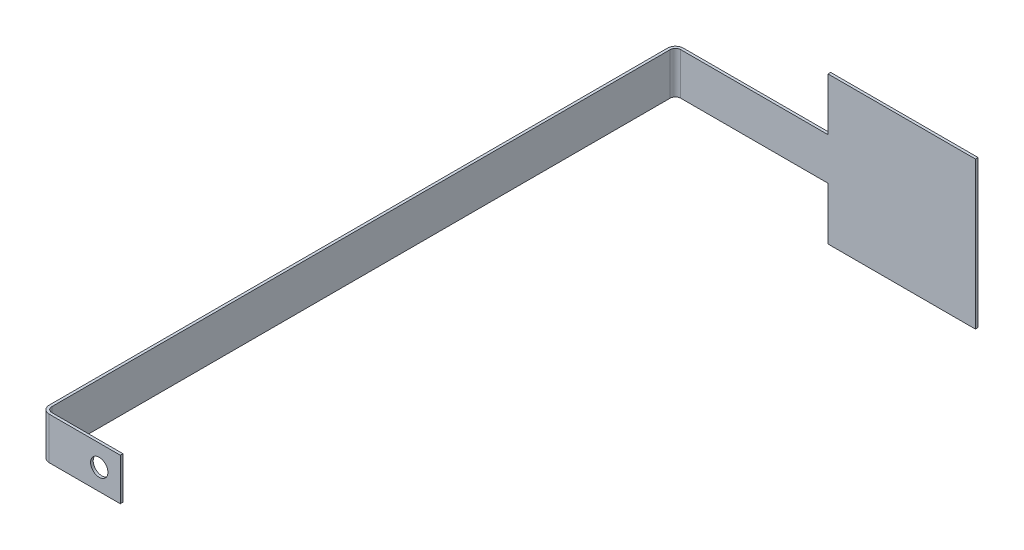
ISO-10303-21;
HEADER;
FILE_DESCRIPTION(('STEP AP214'),'2;1');
FILE_NAME('part.step','',(''),(''),'','','');
FILE_SCHEMA(('AUTOMOTIVE_DESIGN { 1 0 10303 214 1 1 1 1 }'));
ENDSEC;
DATA;
#1=APPLICATION_CONTEXT('core data for automotive mechanical design processes');
#2=APPLICATION_PROTOCOL_DEFINITION('international standard','automotive_design',2000,#1);
#3=PRODUCT_CONTEXT('',#1,'mechanical');
#4=PRODUCT('Part','Part','',(#3));
#5=PRODUCT_RELATED_PRODUCT_CATEGORY('part','',(#4));
#6=PRODUCT_DEFINITION_FORMATION('','',#4);
#7=PRODUCT_DEFINITION_CONTEXT('part definition',#1,'design');
#8=PRODUCT_DEFINITION('design','',#6,#7);
#9=PRODUCT_DEFINITION_SHAPE('','',#8);
#10=(LENGTH_UNIT() NAMED_UNIT(*) SI_UNIT(.MILLI.,.METRE.));
#11=(NAMED_UNIT(*) PLANE_ANGLE_UNIT() SI_UNIT($,.RADIAN.));
#12=(NAMED_UNIT(*) SI_UNIT($,.STERADIAN.) SOLID_ANGLE_UNIT());
#13=UNCERTAINTY_MEASURE_WITH_UNIT(LENGTH_MEASURE(1.E-05),#10,'distance_accuracy_value','');
#14=(GEOMETRIC_REPRESENTATION_CONTEXT(3) GLOBAL_UNCERTAINTY_ASSIGNED_CONTEXT((#13)) GLOBAL_UNIT_ASSIGNED_CONTEXT((#10,
#11,#12)) REPRESENTATION_CONTEXT('',''));
#15=CARTESIAN_POINT('',(0.,0.,0.));
#16=DIRECTION('',(0.,0.,1.));
#17=DIRECTION('',(1.,0.,0.));
#18=AXIS2_PLACEMENT_3D('',#15,#16,#17);
#19=CARTESIAN_POINT('',(-65.,0.,292.));
#20=DIRECTION('',(0.,0.,1.));
#21=DIRECTION('',(1.,0.,0.));
#22=AXIS2_PLACEMENT_3D('',#19,#20,#21);
#23=CYLINDRICAL_SURFACE('',#22,3.3);
#24=DIRECTION('',(0.,0.,1.));
#25=VECTOR('',#24,1.);
#26=CARTESIAN_POINT('',(-61.7,0.,292.));
#27=LINE('',#26,#25);
#28=CARTESIAN_POINT('',(-61.7,0.,293.));
#29=VERTEX_POINT('',#28);
#30=CARTESIAN_POINT('',(-61.7,0.,294.));
#31=VERTEX_POINT('',#30);
#32=EDGE_CURVE('E10',#29,#31,#27,.T.);
#33=ORIENTED_EDGE('',*,*,#32,.F.);
#34=CARTESIAN_POINT('',(-65.,0.,293.));
#35=DIRECTION('',(0.,0.,1.));
#36=DIRECTION('',(1.,0.,0.));
#37=AXIS2_PLACEMENT_3D('',#34,#35,#36);
#38=CIRCLE('',#37,3.3);
#39=EDGE_CURVE('E26',#29,#29,#38,.T.);
#40=ORIENTED_EDGE('',*,*,#39,.F.);
#41=ORIENTED_EDGE('',*,*,#32,.T.);
#42=CARTESIAN_POINT('',(-65.,0.,294.));
#43=DIRECTION('',(0.,0.,1.));
#44=DIRECTION('',(1.,0.,0.));
#45=AXIS2_PLACEMENT_3D('',#42,#43,#44);
#46=CIRCLE('',#45,3.3);
#47=EDGE_CURVE('E307',#31,#31,#46,.T.);
#48=ORIENTED_EDGE('',*,*,#47,.T.);
#49=EDGE_LOOP('',(#33,#40,#41,#48));
#50=FACE_BOUND('',#49,.T.);
#51=ADVANCED_FACE('F16',(#50),#23,.F.);
#52=CARTESIAN_POINT('',(-57.,8.,293.));
#53=DIRECTION('',(-1.,0.,0.));
#54=DIRECTION('',(0.,0.,1.));
#55=AXIS2_PLACEMENT_3D('',#52,#53,#54);
#56=PLANE('',#55);
#57=DIRECTION('',(0.,0.,1.));
#58=VECTOR('',#57,1.);
#59=CARTESIAN_POINT('',(-57.,8.,293.));
#60=LINE('',#59,#58);
#61=CARTESIAN_POINT('',(-57.,8.,293.));
#62=VERTEX_POINT('',#61);
#63=CARTESIAN_POINT('',(-57.,8.,294.));
#64=VERTEX_POINT('',#63);
#65=EDGE_CURVE('E298',#62,#64,#60,.T.);
#66=ORIENTED_EDGE('',*,*,#65,.T.);
#67=DIRECTION('',(0.,-1.,0.));
#68=VECTOR('',#67,1.);
#69=CARTESIAN_POINT('',(-57.,8.,294.));
#70=LINE('',#69,#68);
#71=CARTESIAN_POINT('',(-57.,-8.,294.));
#72=VERTEX_POINT('',#71);
#73=EDGE_CURVE('E283',#64,#72,#70,.T.);
#74=ORIENTED_EDGE('',*,*,#73,.T.);
#75=DIRECTION('',(0.,0.,1.));
#76=VECTOR('',#75,1.);
#77=CARTESIAN_POINT('',(-57.,-8.,293.));
#78=LINE('',#77,#76);
#79=CARTESIAN_POINT('',(-57.,-8.,293.));
#80=VERTEX_POINT('',#79);
#81=EDGE_CURVE('E264',#80,#72,#78,.T.);
#82=ORIENTED_EDGE('',*,*,#81,.F.);
#83=DIRECTION('',(0.,-1.,0.));
#84=VECTOR('',#83,1.);
#85=CARTESIAN_POINT('',(-57.,8.,293.));
#86=LINE('',#85,#84);
#87=EDGE_CURVE('E229',#62,#80,#86,.T.);
#88=ORIENTED_EDGE('',*,*,#87,.F.);
#89=EDGE_LOOP('',(#66,#74,#82,#88));
#90=FACE_BOUND('',#89,.T.);
#91=ADVANCED_FACE('F393',(#90),#56,.F.);
#92=CARTESIAN_POINT('',(-84.,8.,293.));
#93=DIRECTION('',(0.,0.,1.));
#94=DIRECTION('',(1.,0.,0.));
#95=AXIS2_PLACEMENT_3D('',#92,#93,#94);
#96=PLANE('',#95);
#97=ORIENTED_EDGE('',*,*,#39,.T.);
#98=EDGE_LOOP('',(#97));
#99=FACE_BOUND('',#98,.T.);
#100=DIRECTION('',(1.,0.,0.));
#101=VECTOR('',#100,1.);
#102=CARTESIAN_POINT('',(-84.,8.,293.));
#103=LINE('',#102,#101);
#104=CARTESIAN_POINT('',(-84.,8.,293.));
#105=VERTEX_POINT('',#104);
#106=EDGE_CURVE('E279',#105,#62,#103,.T.);
#107=ORIENTED_EDGE('',*,*,#106,.T.);
#108=ORIENTED_EDGE('',*,*,#87,.T.);
#109=DIRECTION('',(1.,0.,0.));
#110=VECTOR('',#109,1.);
#111=CARTESIAN_POINT('',(-84.,-8.,293.));
#112=LINE('',#111,#110);
#113=CARTESIAN_POINT('',(-84.,-8.,293.));
#114=VERTEX_POINT('',#113);
#115=EDGE_CURVE('E260',#114,#80,#112,.T.);
#116=ORIENTED_EDGE('',*,*,#115,.F.);
#117=DIRECTION('',(0.,-1.,0.));
#118=VECTOR('',#117,1.);
#119=CARTESIAN_POINT('',(-84.,8.,293.));
#120=LINE('',#119,#118);
#121=EDGE_CURVE('E231',#105,#114,#120,.T.);
#122=ORIENTED_EDGE('',*,*,#121,.F.);
#123=EDGE_LOOP('',(#107,#108,#116,#122));
#124=FACE_BOUND('',#123,.T.);
#125=ADVANCED_FACE('F523',(#99,#124),#96,.F.);
#126=CARTESIAN_POINT('',(-84.00000000009,8.,291.00000000009));
#127=DIRECTION('',(0.,1.,0.));
#128=DIRECTION('',(-1.,0.,-4.590106073221E-11));
#129=AXIS2_PLACEMENT_3D('',#126,#127,#128);
#130=CYLINDRICAL_SURFACE('',#129,1.999999999908);
#131=CARTESIAN_POINT('',(-84.00000000009,8.,291.00000000009));
#132=DIRECTION('',(0.,1.,0.));
#133=DIRECTION('',(-1.,0.,-4.590106073221E-11));
#134=AXIS2_PLACEMENT_3D('',#131,#132,#133);
#135=CIRCLE('',#134,1.999999999908);
#136=CARTESIAN_POINT('',(-86.,8.,291.));
#137=VERTEX_POINT('',#136);
#138=EDGE_CURVE('E189',#137,#105,#135,.T.);
#139=ORIENTED_EDGE('',*,*,#138,.T.);
#140=ORIENTED_EDGE('',*,*,#121,.T.);
#141=CARTESIAN_POINT('',(-84.00000000009,-8.,291.00000000009));
#142=DIRECTION('',(0.,1.,0.));
#143=DIRECTION('',(-1.,0.,-4.590106073221E-11));
#144=AXIS2_PLACEMENT_3D('',#141,#142,#143);
#145=CIRCLE('',#144,1.999999999908);
#146=CARTESIAN_POINT('',(-86.,-8.,291.));
#147=VERTEX_POINT('',#146);
#148=EDGE_CURVE('E265',#147,#114,#145,.T.);
#149=ORIENTED_EDGE('',*,*,#148,.F.);
#150=DIRECTION('',(0.,-1.,0.));
#151=VECTOR('',#150,1.);
#152=CARTESIAN_POINT('',(-86.,8.,291.));
#153=LINE('',#152,#151);
#154=EDGE_CURVE('E152',#137,#147,#153,.T.);
#155=ORIENTED_EDGE('',*,*,#154,.F.);
#156=EDGE_LOOP('',(#139,#140,#149,#155));
#157=FACE_BOUND('',#156,.T.);
#158=ADVANCED_FACE('F426',(#157),#130,.F.);
#159=CARTESIAN_POINT('',(-86.,8.,56.));
#160=DIRECTION('',(-1.,0.,0.));
#161=DIRECTION('',(0.,0.,1.));
#162=AXIS2_PLACEMENT_3D('',#159,#160,#161);
#163=PLANE('',#162);
#164=DIRECTION('',(0.,0.,1.));
#165=VECTOR('',#164,1.);
#166=CARTESIAN_POINT('',(-86.,8.,56.));
#167=LINE('',#166,#165);
#168=CARTESIAN_POINT('',(-86.,8.,56.));
#169=VERTEX_POINT('',#168);
#170=EDGE_CURVE('E174',#169,#137,#167,.T.);
#171=ORIENTED_EDGE('',*,*,#170,.T.);
#172=ORIENTED_EDGE('',*,*,#154,.T.);
#173=DIRECTION('',(0.,0.,1.));
#174=VECTOR('',#173,1.);
#175=CARTESIAN_POINT('',(-86.,-8.,56.));
#176=LINE('',#175,#174);
#177=CARTESIAN_POINT('',(-86.,-8.,56.));
#178=VERTEX_POINT('',#177);
#179=EDGE_CURVE('E236',#178,#147,#176,.T.);
#180=ORIENTED_EDGE('',*,*,#179,.F.);
#181=DIRECTION('',(0.,-1.,0.));
#182=VECTOR('',#181,1.);
#183=CARTESIAN_POINT('',(-86.,8.,56.));
#184=LINE('',#183,#182);
#185=EDGE_CURVE('E266',#169,#178,#184,.T.);
#186=ORIENTED_EDGE('',*,*,#185,.F.);
#187=EDGE_LOOP('',(#171,#172,#180,#186));
#188=FACE_BOUND('',#187,.T.);
#189=ADVANCED_FACE('F367',(#188),#163,.F.);
#190=CARTESIAN_POINT('',(-84.00000000013,8.,55.999999999862));
#191=DIRECTION('',(0.,1.,0.));
#192=DIRECTION('',(-1.,0.,4.592948244164E-11));
#193=AXIS2_PLACEMENT_3D('',#190,#191,#192);
#194=CYLINDRICAL_SURFACE('',#193,2.999999999862);
#195=CARTESIAN_POINT('',(-84.00000000013,8.,55.999999999862));
#196=DIRECTION('',(0.,-1.,0.));
#197=DIRECTION('',(-1.,0.,4.592948244164E-11));
#198=AXIS2_PLACEMENT_3D('',#195,#196,#197);
#199=CIRCLE('',#198,2.999999999862);
#200=CARTESIAN_POINT('',(-87.,8.,56.));
#201=VERTEX_POINT('',#200);
#202=CARTESIAN_POINT('',(-84.,8.,53.));
#203=VERTEX_POINT('',#202);
#204=EDGE_CURVE('E146',#201,#203,#199,.T.);
#205=ORIENTED_EDGE('',*,*,#204,.T.);
#206=DIRECTION('',(0.,-1.,0.));
#207=VECTOR('',#206,1.);
#208=CARTESIAN_POINT('',(-84.,8.,53.));
#209=LINE('',#208,#207);
#210=CARTESIAN_POINT('',(-84.,-8.,53.));
#211=VERTEX_POINT('',#210);
#212=EDGE_CURVE('E19',#203,#211,#209,.T.);
#213=ORIENTED_EDGE('',*,*,#212,.T.);
#214=CARTESIAN_POINT('',(-84.00000000013,-8.,55.999999999862));
#215=DIRECTION('',(0.,-1.,0.));
#216=DIRECTION('',(-1.,0.,4.592948244164E-11));
#217=AXIS2_PLACEMENT_3D('',#214,#215,#216);
#218=CIRCLE('',#217,2.999999999862);
#219=CARTESIAN_POINT('',(-87.,-8.,56.));
#220=VERTEX_POINT('',#219);
#221=EDGE_CURVE('E149',#220,#211,#218,.T.);
#222=ORIENTED_EDGE('',*,*,#221,.F.);
#223=DIRECTION('',(0.,-1.,0.));
#224=VECTOR('',#223,1.);
#225=CARTESIAN_POINT('',(-87.,8.,56.));
#226=LINE('',#225,#224);
#227=EDGE_CURVE('E143',#201,#220,#226,.T.);
#228=ORIENTED_EDGE('',*,*,#227,.F.);
#229=EDGE_LOOP('',(#205,#213,#222,#228));
#230=FACE_BOUND('',#229,.T.);
#231=ADVANCED_FACE('F144',(#230),#194,.T.);
#232=CARTESIAN_POINT('',(-87.,8.,291.));
#233=DIRECTION('',(1.,0.,0.));
#234=DIRECTION('',(0.,0.,-1.));
#235=AXIS2_PLACEMENT_3D('',#232,#233,#234);
#236=PLANE('',#235);
#237=DIRECTION('',(0.,0.,-1.));
#238=VECTOR('',#237,1.);
#239=CARTESIAN_POINT('',(-87.,8.,291.));
#240=LINE('',#239,#238);
#241=CARTESIAN_POINT('',(-87.,8.,291.));
#242=VERTEX_POINT('',#241);
#243=EDGE_CURVE('E155',#242,#201,#240,.T.);
#244=ORIENTED_EDGE('',*,*,#243,.T.);
#245=ORIENTED_EDGE('',*,*,#227,.T.);
#246=DIRECTION('',(0.,0.,-1.));
#247=VECTOR('',#246,1.);
#248=CARTESIAN_POINT('',(-87.,-8.,291.));
#249=LINE('',#248,#247);
#250=CARTESIAN_POINT('',(-87.,-8.,291.));
#251=VERTEX_POINT('',#250);
#252=EDGE_CURVE('E244',#251,#220,#249,.T.);
#253=ORIENTED_EDGE('',*,*,#252,.F.);
#254=DIRECTION('',(0.,-1.,0.));
#255=VECTOR('',#254,1.);
#256=CARTESIAN_POINT('',(-87.,8.,291.));
#257=LINE('',#256,#255);
#258=EDGE_CURVE('E132',#242,#251,#257,.T.);
#259=ORIENTED_EDGE('',*,*,#258,.F.);
#260=EDGE_LOOP('',(#244,#245,#253,#259));
#261=FACE_BOUND('',#260,.T.);
#262=ADVANCED_FACE('F156',(#261),#236,.F.);
#263=CARTESIAN_POINT('',(-84.00000000013,8.,291.00000000013));
#264=DIRECTION('',(0.,1.,0.));
#265=DIRECTION('',(4.594369329636E-11,0.,1.));
#266=AXIS2_PLACEMENT_3D('',#263,#264,#265);
#267=CYLINDRICAL_SURFACE('',#266,2.999999999862);
#268=CARTESIAN_POINT('',(-84.00000000013,8.,291.00000000013));
#269=DIRECTION('',(0.,-1.,0.));
#270=DIRECTION('',(4.594369329636E-11,0.,1.));
#271=AXIS2_PLACEMENT_3D('',#268,#269,#270);
#272=CIRCLE('',#271,2.999999999862);
#273=CARTESIAN_POINT('',(-84.,8.,294.));
#274=VERTEX_POINT('',#273);
#275=EDGE_CURVE('E160',#274,#242,#272,.T.);
#276=ORIENTED_EDGE('',*,*,#275,.T.);
#277=ORIENTED_EDGE('',*,*,#258,.T.);
#278=CARTESIAN_POINT('',(-84.00000000013,-8.,291.00000000013));
#279=DIRECTION('',(0.,-1.,0.));
#280=DIRECTION('',(4.594369329636E-11,0.,1.));
#281=AXIS2_PLACEMENT_3D('',#278,#279,#280);
#282=CIRCLE('',#281,2.999999999862);
#283=CARTESIAN_POINT('',(-84.,-8.,294.));
#284=VERTEX_POINT('',#283);
#285=EDGE_CURVE('E240',#284,#251,#282,.T.);
#286=ORIENTED_EDGE('',*,*,#285,.F.);
#287=DIRECTION('',(0.,-1.,0.));
#288=VECTOR('',#287,1.);
#289=CARTESIAN_POINT('',(-84.,8.,294.));
#290=LINE('',#289,#288);
#291=EDGE_CURVE('E270',#274,#284,#290,.T.);
#292=ORIENTED_EDGE('',*,*,#291,.F.);
#293=EDGE_LOOP('',(#276,#277,#286,#292));
#294=FACE_BOUND('',#293,.T.);
#295=ADVANCED_FACE('F452',(#294),#267,.T.);
#296=CARTESIAN_POINT('',(-57.,8.,294.));
#297=DIRECTION('',(0.,0.,-1.));
#298=DIRECTION('',(0.,-1.,0.));
#299=AXIS2_PLACEMENT_3D('',#296,#297,#298);
#300=PLANE('',#299);
#301=ORIENTED_EDGE('',*,*,#47,.F.);
#302=EDGE_LOOP('',(#301));
#303=FACE_BOUND('',#302,.T.);
#304=DIRECTION('',(-1.,0.,0.));
#305=VECTOR('',#304,1.);
#306=CARTESIAN_POINT('',(-57.,8.,294.));
#307=LINE('',#306,#305);
#308=EDGE_CURVE('E271',#64,#274,#307,.T.);
#309=ORIENTED_EDGE('',*,*,#308,.T.);
#310=ORIENTED_EDGE('',*,*,#291,.T.);
#311=DIRECTION('',(-1.,0.,0.));
#312=VECTOR('',#311,1.);
#313=CARTESIAN_POINT('',(-57.,-8.,294.));
#314=LINE('',#313,#312);
#315=EDGE_CURVE('E245',#72,#284,#314,.T.);
#316=ORIENTED_EDGE('',*,*,#315,.F.);
#317=ORIENTED_EDGE('',*,*,#73,.F.);
#318=EDGE_LOOP('',(#309,#310,#316,#317));
#319=FACE_BOUND('',#318,.T.);
#320=ADVANCED_FACE('F402',(#303,#319),#300,.F.);
#321=CARTESIAN_POINT('',(-84.00000000009,8.,55.999999999908));
#322=DIRECTION('',(0.,1.,0.));
#323=DIRECTION('',(4.592237701428E-11,0.,-1.));
#324=AXIS2_PLACEMENT_3D('',#321,#322,#323);
#325=CYLINDRICAL_SURFACE('',#324,1.999999999908);
#326=CARTESIAN_POINT('',(-84.00000000009,8.,55.999999999908));
#327=DIRECTION('',(0.,1.,0.));
#328=DIRECTION('',(4.592237701428E-11,0.,-1.));
#329=AXIS2_PLACEMENT_3D('',#326,#327,#328);
#330=CIRCLE('',#329,1.999999999908);
#331=CARTESIAN_POINT('',(-84.,8.,54.));
#332=VERTEX_POINT('',#331);
#333=EDGE_CURVE('E168',#332,#169,#330,.T.);
#334=ORIENTED_EDGE('',*,*,#333,.T.);
#335=ORIENTED_EDGE('',*,*,#185,.T.);
#336=CARTESIAN_POINT('',(-84.00000000009,-8.,55.999999999908));
#337=DIRECTION('',(0.,1.,0.));
#338=DIRECTION('',(4.592237701428E-11,0.,-1.));
#339=AXIS2_PLACEMENT_3D('',#336,#337,#338);
#340=CIRCLE('',#339,1.999999999908);
#341=CARTESIAN_POINT('',(-84.,-8.,54.));
#342=VERTEX_POINT('',#341);
#343=EDGE_CURVE('E232',#342,#178,#340,.T.);
#344=ORIENTED_EDGE('',*,*,#343,.F.);
#345=DIRECTION('',(0.,-1.,0.));
#346=VECTOR('',#345,1.);
#347=CARTESIAN_POINT('',(-84.,8.,54.));
#348=LINE('',#347,#346);
#349=EDGE_CURVE('E272',#332,#342,#348,.T.);
#350=ORIENTED_EDGE('',*,*,#349,.F.);
#351=EDGE_LOOP('',(#334,#335,#344,#350));
#352=FACE_BOUND('',#351,.T.);
#353=ADVANCED_FACE('F362',(#352),#325,.F.);
#354=CARTESIAN_POINT('',(-79.7953123297,8.,162.85013062894));
#355=DIRECTION('',(0.,-1.,0.));
#356=DIRECTION('',(0.,0.,-1.));
#357=AXIS2_PLACEMENT_3D('',#354,#355,#356);
#358=PLANE('',#357);
#359=ORIENTED_EDGE('',*,*,#65,.F.);
#360=ORIENTED_EDGE('',*,*,#106,.F.);
#361=ORIENTED_EDGE('',*,*,#138,.F.);
#362=ORIENTED_EDGE('',*,*,#170,.F.);
#363=ORIENTED_EDGE('',*,*,#333,.F.);
#364=DIRECTION('',(-1.,0.,0.));
#365=VECTOR('',#364,1.);
#366=CARTESIAN_POINT('',(-28.,8.,54.));
#367=LINE('',#366,#365);
#368=CARTESIAN_POINT('',(-28.,8.,54.));
#369=VERTEX_POINT('',#368);
#370=EDGE_CURVE('E254',#369,#332,#367,.T.);
#371=ORIENTED_EDGE('',*,*,#370,.F.);
#372=DIRECTION('',(0.,0.,1.));
#373=VECTOR('',#372,1.);
#374=CARTESIAN_POINT('',(-28.,8.,53.));
#375=LINE('',#374,#373);
#376=CARTESIAN_POINT('',(-28.,8.,53.));
#377=VERTEX_POINT('',#376);
#378=EDGE_CURVE('E193',#377,#369,#375,.T.);
#379=ORIENTED_EDGE('',*,*,#378,.F.);
#380=DIRECTION('',(1.,0.,0.));
#381=VECTOR('',#380,1.);
#382=CARTESIAN_POINT('',(-84.,8.,53.));
#383=LINE('',#382,#381);
#384=EDGE_CURVE('E165',#203,#377,#383,.T.);
#385=ORIENTED_EDGE('',*,*,#384,.F.);
#386=ORIENTED_EDGE('',*,*,#204,.F.);
#387=ORIENTED_EDGE('',*,*,#243,.F.);
#388=ORIENTED_EDGE('',*,*,#275,.F.);
#389=ORIENTED_EDGE('',*,*,#308,.F.);
#390=EDGE_LOOP('',(#359,#360,#361,#362,#363,#371,#379,#385,#386,#387,#388,#389));
#391=FACE_BOUND('',#390,.T.);
#392=ADVANCED_FACE('F163',(#391),#358,.F.);
#393=CARTESIAN_POINT('',(-28.,-28.,53.));
#394=DIRECTION('',(1.,0.,0.));
#395=DIRECTION('',(0.,1.,0.));
#396=AXIS2_PLACEMENT_3D('',#393,#394,#395);
#397=PLANE('',#396);
#398=DIRECTION('',(0.,0.,1.));
#399=VECTOR('',#398,1.);
#400=CARTESIAN_POINT('',(-28.,28.,53.));
#401=LINE('',#400,#399);
#402=CARTESIAN_POINT('',(-28.,28.,53.));
#403=VERTEX_POINT('',#402);
#404=CARTESIAN_POINT('',(-28.,28.,54.));
#405=VERTEX_POINT('',#404);
#406=EDGE_CURVE('E190',#403,#405,#401,.T.);
#407=ORIENTED_EDGE('',*,*,#406,.F.);
#408=DIRECTION('',(0.,1.,0.));
#409=VECTOR('',#408,1.);
#410=CARTESIAN_POINT('',(-28.,-28.,53.));
#411=LINE('',#410,#409);
#412=EDGE_CURVE('E177',#377,#403,#411,.T.);
#413=ORIENTED_EDGE('',*,*,#412,.F.);
#414=ORIENTED_EDGE('',*,*,#378,.T.);
#415=DIRECTION('',(0.,1.,0.));
#416=VECTOR('',#415,1.);
#417=CARTESIAN_POINT('',(-28.,-28.,54.));
#418=LINE('',#417,#416);
#419=EDGE_CURVE('E250',#369,#405,#418,.T.);
#420=ORIENTED_EDGE('',*,*,#419,.T.);
#421=EDGE_LOOP('',(#407,#413,#414,#420));
#422=FACE_BOUND('',#421,.T.);
#423=ADVANCED_FACE('F417',(#422),#397,.F.);
#424=CARTESIAN_POINT('',(-28.,28.,53.));
#425=DIRECTION('',(0.,1.,0.));
#426=DIRECTION('',(1.,0.,0.));
#427=AXIS2_PLACEMENT_3D('',#424,#425,#426);
#428=PLANE('',#427);
#429=DIRECTION('',(1.,0.,0.));
#430=VECTOR('',#429,1.);
#431=CARTESIAN_POINT('',(-28.,28.,53.));
#432=LINE('',#431,#430);
#433=CARTESIAN_POINT('',(28.,28.,53.));
#434=VERTEX_POINT('',#433);
#435=EDGE_CURVE('E207',#403,#434,#432,.T.);
#436=ORIENTED_EDGE('',*,*,#435,.F.);
#437=ORIENTED_EDGE('',*,*,#406,.T.);
#438=DIRECTION('',(1.,0.,0.));
#439=VECTOR('',#438,1.);
#440=CARTESIAN_POINT('',(-28.,28.,54.));
#441=LINE('',#440,#439);
#442=CARTESIAN_POINT('',(28.,28.,54.));
#443=VERTEX_POINT('',#442);
#444=EDGE_CURVE('E255',#405,#443,#441,.T.);
#445=ORIENTED_EDGE('',*,*,#444,.T.);
#446=DIRECTION('',(0.,0.,1.));
#447=VECTOR('',#446,1.);
#448=CARTESIAN_POINT('',(28.,28.,53.));
#449=LINE('',#448,#447);
#450=EDGE_CURVE('E194',#434,#443,#449,.T.);
#451=ORIENTED_EDGE('',*,*,#450,.F.);
#452=EDGE_LOOP('',(#436,#437,#445,#451));
#453=FACE_BOUND('',#452,.T.);
#454=ADVANCED_FACE('F330',(#453),#428,.T.);
#455=CARTESIAN_POINT('',(28.,-28.,53.));
#456=DIRECTION('',(1.,0.,0.));
#457=DIRECTION('',(0.,1.,0.));
#458=AXIS2_PLACEMENT_3D('',#455,#456,#457);
#459=PLANE('',#458);
#460=DIRECTION('',(0.,0.,1.));
#461=VECTOR('',#460,1.);
#462=CARTESIAN_POINT('',(28.,-28.,53.));
#463=LINE('',#462,#461);
#464=CARTESIAN_POINT('',(28.,-28.,53.));
#465=VERTEX_POINT('',#464);
#466=CARTESIAN_POINT('',(28.,-28.,54.));
#467=VERTEX_POINT('',#466);
#468=EDGE_CURVE('E216',#465,#467,#463,.T.);
#469=ORIENTED_EDGE('',*,*,#468,.F.);
#470=DIRECTION('',(0.,1.,0.));
#471=VECTOR('',#470,1.);
#472=CARTESIAN_POINT('',(28.,-28.,53.));
#473=LINE('',#472,#471);
#474=EDGE_CURVE('E203',#465,#434,#473,.T.);
#475=ORIENTED_EDGE('',*,*,#474,.T.);
#476=ORIENTED_EDGE('',*,*,#450,.T.);
#477=DIRECTION('',(0.,1.,0.));
#478=VECTOR('',#477,1.);
#479=CARTESIAN_POINT('',(28.,-28.,54.));
#480=LINE('',#479,#478);
#481=EDGE_CURVE('E249',#467,#443,#480,.T.);
#482=ORIENTED_EDGE('',*,*,#481,.F.);
#483=EDGE_LOOP('',(#469,#475,#476,#482));
#484=FACE_BOUND('',#483,.T.);
#485=ADVANCED_FACE('F327',(#484),#459,.T.);
#486=CARTESIAN_POINT('',(-28.,-28.,53.));
#487=DIRECTION('',(0.,1.,0.));
#488=DIRECTION('',(1.,0.,0.));
#489=AXIS2_PLACEMENT_3D('',#486,#487,#488);
#490=PLANE('',#489);
#491=ORIENTED_EDGE('',*,*,#468,.T.);
#492=DIRECTION('',(1.,0.,0.));
#493=VECTOR('',#492,1.);
#494=CARTESIAN_POINT('',(-28.,-28.,54.));
#495=LINE('',#494,#493);
#496=CARTESIAN_POINT('',(-28.,-28.,54.));
#497=VERTEX_POINT('',#496);
#498=EDGE_CURVE('E184',#497,#467,#495,.T.);
#499=ORIENTED_EDGE('',*,*,#498,.F.);
#500=DIRECTION('',(0.,0.,1.));
#501=VECTOR('',#500,1.);
#502=CARTESIAN_POINT('',(-28.,-28.,53.));
#503=LINE('',#502,#501);
#504=CARTESIAN_POINT('',(-28.,-28.,53.));
#505=VERTEX_POINT('',#504);
#506=EDGE_CURVE('E185',#505,#497,#503,.T.);
#507=ORIENTED_EDGE('',*,*,#506,.F.);
#508=DIRECTION('',(1.,0.,0.));
#509=VECTOR('',#508,1.);
#510=CARTESIAN_POINT('',(-28.,-28.,53.));
#511=LINE('',#510,#509);
#512=EDGE_CURVE('E206',#505,#465,#511,.T.);
#513=ORIENTED_EDGE('',*,*,#512,.T.);
#514=EDGE_LOOP('',(#491,#499,#507,#513));
#515=FACE_BOUND('',#514,.T.);
#516=ADVANCED_FACE('F338',(#515),#490,.F.);
#517=CARTESIAN_POINT('',(-28.,-28.,53.));
#518=DIRECTION('',(0.,0.,1.));
#519=DIRECTION('',(1.,0.,0.));
#520=AXIS2_PLACEMENT_3D('',#517,#518,#519);
#521=PLANE('',#520);
#522=DIRECTION('',(1.,0.,0.));
#523=VECTOR('',#522,1.);
#524=CARTESIAN_POINT('',(-84.,-8.,53.));
#525=LINE('',#524,#523);
#526=CARTESIAN_POINT('',(-28.,-8.,53.));
#527=VERTEX_POINT('',#526);
#528=EDGE_CURVE('E237',#211,#527,#525,.T.);
#529=ORIENTED_EDGE('',*,*,#528,.F.);
#530=ORIENTED_EDGE('',*,*,#212,.F.);
#531=ORIENTED_EDGE('',*,*,#384,.T.);
#532=ORIENTED_EDGE('',*,*,#412,.T.);
#533=ORIENTED_EDGE('',*,*,#435,.T.);
#534=ORIENTED_EDGE('',*,*,#474,.F.);
#535=ORIENTED_EDGE('',*,*,#512,.F.);
#536=DIRECTION('',(0.,1.,0.));
#537=VECTOR('',#536,1.);
#538=CARTESIAN_POINT('',(-28.,-28.,53.));
#539=LINE('',#538,#537);
#540=EDGE_CURVE('E196',#505,#527,#539,.T.);
#541=ORIENTED_EDGE('',*,*,#540,.T.);
#542=EDGE_LOOP('',(#529,#530,#531,#532,#533,#534,#535,#541));
#543=FACE_BOUND('',#542,.T.);
#544=ADVANCED_FACE('F344',(#543),#521,.F.);
#545=CARTESIAN_POINT('',(-79.7953123297,-8.,162.85013062894));
#546=DIRECTION('',(0.,-1.,0.));
#547=DIRECTION('',(0.,0.,-1.));
#548=AXIS2_PLACEMENT_3D('',#545,#546,#547);
#549=PLANE('',#548);
#550=ORIENTED_EDGE('',*,*,#315,.T.);
#551=ORIENTED_EDGE('',*,*,#285,.T.);
#552=ORIENTED_EDGE('',*,*,#252,.T.);
#553=ORIENTED_EDGE('',*,*,#221,.T.);
#554=ORIENTED_EDGE('',*,*,#528,.T.);
#555=DIRECTION('',(0.,0.,1.));
#556=VECTOR('',#555,1.);
#557=CARTESIAN_POINT('',(-28.,-8.,53.));
#558=LINE('',#557,#556);
#559=CARTESIAN_POINT('',(-28.,-8.,54.));
#560=VERTEX_POINT('',#559);
#561=EDGE_CURVE('E200',#527,#560,#558,.T.);
#562=ORIENTED_EDGE('',*,*,#561,.T.);
#563=DIRECTION('',(-1.,0.,0.));
#564=VECTOR('',#563,1.);
#565=CARTESIAN_POINT('',(-28.,-8.,54.));
#566=LINE('',#565,#564);
#567=EDGE_CURVE('E259',#560,#342,#566,.T.);
#568=ORIENTED_EDGE('',*,*,#567,.T.);
#569=ORIENTED_EDGE('',*,*,#343,.T.);
#570=ORIENTED_EDGE('',*,*,#179,.T.);
#571=ORIENTED_EDGE('',*,*,#148,.T.);
#572=ORIENTED_EDGE('',*,*,#115,.T.);
#573=ORIENTED_EDGE('',*,*,#81,.T.);
#574=EDGE_LOOP('',(#550,#551,#552,#553,#554,#562,#568,#569,#570,#571,#572,#573));
#575=FACE_BOUND('',#574,.T.);
#576=ADVANCED_FACE('F374',(#575),#549,.T.);
#577=CARTESIAN_POINT('',(-28.,-28.,54.));
#578=DIRECTION('',(0.,0.,1.));
#579=DIRECTION('',(1.,0.,0.));
#580=AXIS2_PLACEMENT_3D('',#577,#578,#579);
#581=PLANE('',#580);
#582=DIRECTION('',(0.,1.,0.));
#583=VECTOR('',#582,1.);
#584=CARTESIAN_POINT('',(-28.,-28.,54.));
#585=LINE('',#584,#583);
#586=EDGE_CURVE('E180',#497,#560,#585,.T.);
#587=ORIENTED_EDGE('',*,*,#586,.F.);
#588=ORIENTED_EDGE('',*,*,#498,.T.);
#589=ORIENTED_EDGE('',*,*,#481,.T.);
#590=ORIENTED_EDGE('',*,*,#444,.F.);
#591=ORIENTED_EDGE('',*,*,#419,.F.);
#592=ORIENTED_EDGE('',*,*,#370,.T.);
#593=ORIENTED_EDGE('',*,*,#349,.T.);
#594=ORIENTED_EDGE('',*,*,#567,.F.);
#595=EDGE_LOOP('',(#587,#588,#589,#590,#591,#592,#593,#594));
#596=FACE_BOUND('',#595,.T.);
#597=ADVANCED_FACE('F335',(#596),#581,.T.);
#598=CARTESIAN_POINT('',(-28.,-28.,53.));
#599=DIRECTION('',(1.,0.,0.));
#600=DIRECTION('',(0.,1.,0.));
#601=AXIS2_PLACEMENT_3D('',#598,#599,#600);
#602=PLANE('',#601);
#603=ORIENTED_EDGE('',*,*,#561,.F.);
#604=ORIENTED_EDGE('',*,*,#540,.F.);
#605=ORIENTED_EDGE('',*,*,#506,.T.);
#606=ORIENTED_EDGE('',*,*,#586,.T.);
#607=EDGE_LOOP('',(#603,#604,#605,#606));
#608=FACE_BOUND('',#607,.T.);
#609=ADVANCED_FACE('F342',(#608),#602,.F.);
#610=CLOSED_SHELL('',(#51,#91,#125,#158,#189,#231,#262,#295,#320,#353,#392,#423,#454,#485,#516,
#544,#576,#597,#609));
#611=MANIFOLD_SOLID_BREP('B1',#610);
#612=ADVANCED_BREP_SHAPE_REPRESENTATION('',(#18,#611),#14);
#613=SHAPE_DEFINITION_REPRESENTATION(#9,#612);
ENDSEC;
END-ISO-10303-21;
